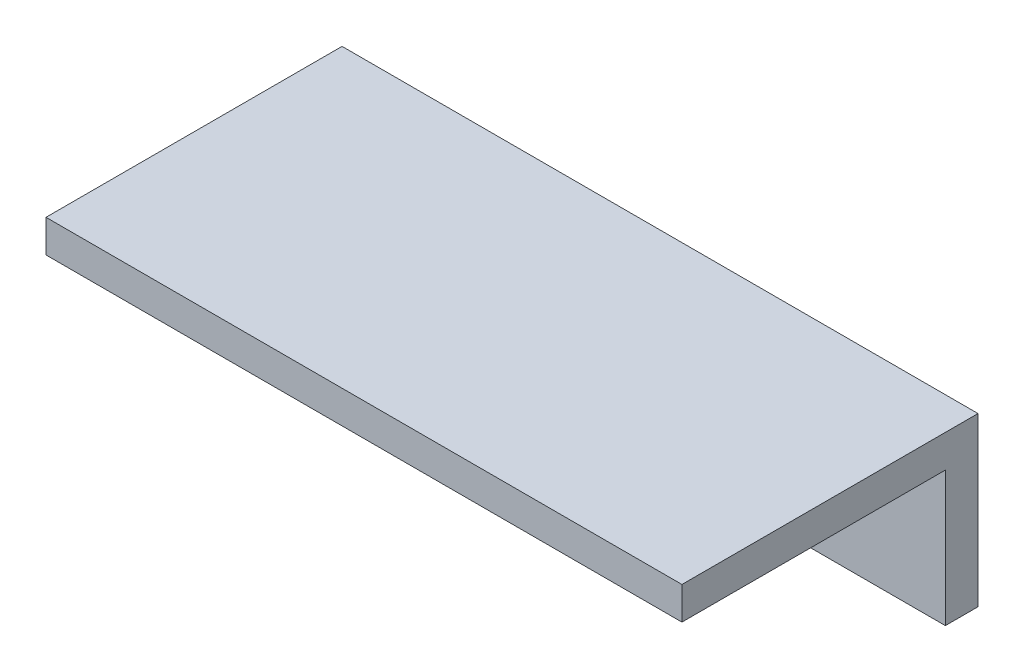
ISO-10303-21;
HEADER;
FILE_DESCRIPTION(('STEP AP214'),'2;1');
FILE_NAME('part.step','',(''),(''),'','','');
FILE_SCHEMA(('AUTOMOTIVE_DESIGN { 1 0 10303 214 1 1 1 1 }'));
ENDSEC;
DATA;
#1=APPLICATION_CONTEXT('core data for automotive mechanical design processes');
#2=APPLICATION_PROTOCOL_DEFINITION('international standard','automotive_design',2000,#1);
#3=PRODUCT_CONTEXT('',#1,'mechanical');
#4=PRODUCT('Part','Part','',(#3));
#5=PRODUCT_RELATED_PRODUCT_CATEGORY('part','',(#4));
#6=PRODUCT_DEFINITION_FORMATION('','',#4);
#7=PRODUCT_DEFINITION_CONTEXT('part definition',#1,'design');
#8=PRODUCT_DEFINITION('design','',#6,#7);
#9=PRODUCT_DEFINITION_SHAPE('','',#8);
#10=(LENGTH_UNIT() NAMED_UNIT(*) SI_UNIT(.MILLI.,.METRE.));
#11=(NAMED_UNIT(*) PLANE_ANGLE_UNIT() SI_UNIT($,.RADIAN.));
#12=(NAMED_UNIT(*) SI_UNIT($,.STERADIAN.) SOLID_ANGLE_UNIT());
#13=UNCERTAINTY_MEASURE_WITH_UNIT(LENGTH_MEASURE(1.E-05),#10,'distance_accuracy_value','');
#14=(GEOMETRIC_REPRESENTATION_CONTEXT(3) GLOBAL_UNCERTAINTY_ASSIGNED_CONTEXT((#13)) GLOBAL_UNIT_ASSIGNED_CONTEXT((#10,
#11,#12)) REPRESENTATION_CONTEXT('',''));
#15=CARTESIAN_POINT('',(0.,0.,0.));
#16=DIRECTION('',(0.,0.,1.));
#17=DIRECTION('',(1.,0.,0.));
#18=AXIS2_PLACEMENT_3D('',#15,#16,#17);
#19=CARTESIAN_POINT('',(-34.1,-8.975,3.5));
#20=DIRECTION('',(1.,0.,0.));
#21=DIRECTION('',(0.,0.,-1.));
#22=AXIS2_PLACEMENT_3D('',#19,#20,#21);
#23=PLANE('',#22);
#24=DIRECTION('',(0.,-1.,0.));
#25=VECTOR('',#24,1.);
#26=CARTESIAN_POINT('',(-34.1,-8.975,0.));
#27=LINE('',#26,#25);
#28=CARTESIAN_POINT('',(-34.1,8.975,0.));
#29=VERTEX_POINT('',#28);
#30=CARTESIAN_POINT('',(-34.1,-8.975,0.));
#31=VERTEX_POINT('',#30);
#32=EDGE_CURVE('E91',#29,#31,#27,.T.);
#33=ORIENTED_EDGE('',*,*,#32,.T.);
#34=DIRECTION('',(0.,0.,-1.));
#35=VECTOR('',#34,1.);
#36=CARTESIAN_POINT('',(-34.1,-8.975,3.5));
#37=LINE('',#36,#35);
#38=CARTESIAN_POINT('',(-34.1,-8.975,3.5));
#39=VERTEX_POINT('',#38);
#40=EDGE_CURVE('E11',#39,#31,#37,.T.);
#41=ORIENTED_EDGE('',*,*,#40,.F.);
#42=DIRECTION('',(0.,-1.,0.));
#43=VECTOR('',#42,1.);
#44=CARTESIAN_POINT('',(-34.1,-8.975,3.5));
#45=LINE('',#44,#43);
#46=CARTESIAN_POINT('',(-34.1,5.475,3.5));
#47=VERTEX_POINT('',#46);
#48=EDGE_CURVE('E84',#47,#39,#45,.T.);
#49=ORIENTED_EDGE('',*,*,#48,.F.);
#50=DIRECTION('',(0.,0.,-1.));
#51=VECTOR('',#50,1.);
#52=CARTESIAN_POINT('',(-34.1,5.475,31.75));
#53=LINE('',#52,#51);
#54=CARTESIAN_POINT('',(-34.1,5.475,31.75));
#55=VERTEX_POINT('',#54);
#56=EDGE_CURVE('E99',#55,#47,#53,.T.);
#57=ORIENTED_EDGE('',*,*,#56,.F.);
#58=DIRECTION('',(0.,-1.,0.));
#59=VECTOR('',#58,1.);
#60=CARTESIAN_POINT('',(-34.1,8.975,31.75));
#61=LINE('',#60,#59);
#62=CARTESIAN_POINT('',(-34.1,8.975,31.75));
#63=VERTEX_POINT('',#62);
#64=EDGE_CURVE('E94',#63,#55,#61,.T.);
#65=ORIENTED_EDGE('',*,*,#64,.F.);
#66=DIRECTION('',(0.,0.,-1.));
#67=VECTOR('',#66,1.);
#68=CARTESIAN_POINT('',(-34.1,8.975,3.5));
#69=LINE('',#68,#67);
#70=EDGE_CURVE('E77',#63,#29,#69,.T.);
#71=ORIENTED_EDGE('',*,*,#70,.T.);
#72=EDGE_LOOP('',(#33,#41,#49,#57,#65,#71));
#73=FACE_BOUND('',#72,.T.);
#74=ADVANCED_FACE('F33',(#73),#23,.F.);
#75=CARTESIAN_POINT('',(34.1,-8.975,3.5));
#76=DIRECTION('',(0.,1.,0.));
#77=DIRECTION('',(0.,0.,1.));
#78=AXIS2_PLACEMENT_3D('',#75,#76,#77);
#79=PLANE('',#78);
#80=DIRECTION('',(1.,0.,0.));
#81=VECTOR('',#80,1.);
#82=CARTESIAN_POINT('',(34.1,-8.975,0.));
#83=LINE('',#82,#81);
#84=CARTESIAN_POINT('',(34.1,-8.975,0.));
#85=VERTEX_POINT('',#84);
#86=EDGE_CURVE('E98',#31,#85,#83,.T.);
#87=ORIENTED_EDGE('',*,*,#86,.T.);
#88=DIRECTION('',(0.,0.,-1.));
#89=VECTOR('',#88,1.);
#90=CARTESIAN_POINT('',(34.1,-8.975,3.5));
#91=LINE('',#90,#89);
#92=CARTESIAN_POINT('',(34.1,-8.975,3.5));
#93=VERTEX_POINT('',#92);
#94=EDGE_CURVE('E40',#93,#85,#91,.T.);
#95=ORIENTED_EDGE('',*,*,#94,.F.);
#96=DIRECTION('',(1.,0.,0.));
#97=VECTOR('',#96,1.);
#98=CARTESIAN_POINT('',(34.1,-8.975,3.5));
#99=LINE('',#98,#97);
#100=EDGE_CURVE('E53',#39,#93,#99,.T.);
#101=ORIENTED_EDGE('',*,*,#100,.F.);
#102=ORIENTED_EDGE('',*,*,#40,.T.);
#103=EDGE_LOOP('',(#87,#95,#101,#102));
#104=FACE_BOUND('',#103,.T.);
#105=ADVANCED_FACE('F115',(#104),#79,.F.);
#106=CARTESIAN_POINT('',(34.1,-8.975,3.5));
#107=DIRECTION('',(-1.,0.,0.));
#108=DIRECTION('',(0.,0.,1.));
#109=AXIS2_PLACEMENT_3D('',#106,#107,#108);
#110=PLANE('',#109);
#111=DIRECTION('',(0.,1.,0.));
#112=VECTOR('',#111,1.);
#113=CARTESIAN_POINT('',(34.1,-8.975,0.));
#114=LINE('',#113,#112);
#115=CARTESIAN_POINT('',(34.1,8.975,0.));
#116=VERTEX_POINT('',#115);
#117=EDGE_CURVE('E85',#85,#116,#114,.T.);
#118=ORIENTED_EDGE('',*,*,#117,.T.);
#119=DIRECTION('',(0.,0.,-1.));
#120=VECTOR('',#119,1.);
#121=CARTESIAN_POINT('',(34.1,8.975,3.5));
#122=LINE('',#121,#120);
#123=CARTESIAN_POINT('',(34.1,8.975,31.75));
#124=VERTEX_POINT('',#123);
#125=EDGE_CURVE('E80',#124,#116,#122,.T.);
#126=ORIENTED_EDGE('',*,*,#125,.F.);
#127=DIRECTION('',(0.,1.,0.));
#128=VECTOR('',#127,1.);
#129=CARTESIAN_POINT('',(34.1,8.975,31.75));
#130=LINE('',#129,#128);
#131=CARTESIAN_POINT('',(34.1,5.475,31.75));
#132=VERTEX_POINT('',#131);
#133=EDGE_CURVE('E130',#132,#124,#130,.T.);
#134=ORIENTED_EDGE('',*,*,#133,.F.);
#135=DIRECTION('',(0.,0.,-1.));
#136=VECTOR('',#135,1.);
#137=CARTESIAN_POINT('',(34.1,5.475,31.75));
#138=LINE('',#137,#136);
#139=CARTESIAN_POINT('',(34.1,5.475,3.5));
#140=VERTEX_POINT('',#139);
#141=EDGE_CURVE('E103',#132,#140,#138,.T.);
#142=ORIENTED_EDGE('',*,*,#141,.T.);
#143=DIRECTION('',(0.,1.,0.));
#144=VECTOR('',#143,1.);
#145=CARTESIAN_POINT('',(34.1,-8.975,3.5));
#146=LINE('',#145,#144);
#147=EDGE_CURVE('E95',#93,#140,#146,.T.);
#148=ORIENTED_EDGE('',*,*,#147,.F.);
#149=ORIENTED_EDGE('',*,*,#94,.T.);
#150=EDGE_LOOP('',(#118,#126,#134,#142,#148,#149));
#151=FACE_BOUND('',#150,.T.);
#152=ADVANCED_FACE('F112',(#151),#110,.F.);
#153=CARTESIAN_POINT('',(34.1,8.975,3.5));
#154=DIRECTION('',(0.,-1.,0.));
#155=DIRECTION('',(0.,0.,-1.));
#156=AXIS2_PLACEMENT_3D('',#153,#154,#155);
#157=PLANE('',#156);
#158=DIRECTION('',(-1.,0.,0.));
#159=VECTOR('',#158,1.);
#160=CARTESIAN_POINT('',(34.1,8.975,0.));
#161=LINE('',#160,#159);
#162=EDGE_CURVE('E73',#116,#29,#161,.T.);
#163=ORIENTED_EDGE('',*,*,#162,.T.);
#164=ORIENTED_EDGE('',*,*,#70,.F.);
#165=DIRECTION('',(-1.,0.,0.));
#166=VECTOR('',#165,1.);
#167=CARTESIAN_POINT('',(-34.1,8.975,31.75));
#168=LINE('',#167,#166);
#169=EDGE_CURVE('E133',#124,#63,#168,.T.);
#170=ORIENTED_EDGE('',*,*,#169,.F.);
#171=ORIENTED_EDGE('',*,*,#125,.T.);
#172=EDGE_LOOP('',(#163,#164,#170,#171));
#173=FACE_BOUND('',#172,.T.);
#174=ADVANCED_FACE('F75',(#173),#157,.F.);
#175=CARTESIAN_POINT('',(0.,0.,3.5));
#176=DIRECTION('',(0.,0.,1.));
#177=DIRECTION('',(1.,0.,0.));
#178=AXIS2_PLACEMENT_3D('',#175,#176,#177);
#179=PLANE('',#178);
#180=CARTESIAN_POINT('',(0.,-3.07053348593506,3.5));
#181=DIRECTION('',(0.,0.,1.));
#182=DIRECTION('',(1.,0.,0.));
#183=AXIS2_PLACEMENT_3D('',#180,#181,#182);
#184=CIRCLE('',#183,2.85);
#185=CARTESIAN_POINT('',(2.85,-3.07053348593506,3.5));
#186=VERTEX_POINT('',#185);
#187=EDGE_CURVE('E135',#186,#186,#184,.T.);
#188=ORIENTED_EDGE('',*,*,#187,.F.);
#189=EDGE_LOOP('',(#188));
#190=FACE_BOUND('',#189,.T.);
#191=DIRECTION('',(1.,0.,0.));
#192=VECTOR('',#191,1.);
#193=CARTESIAN_POINT('',(-34.1,5.475,3.5));
#194=LINE('',#193,#192);
#195=EDGE_CURVE('E47',#47,#140,#194,.T.);
#196=ORIENTED_EDGE('',*,*,#195,.F.);
#197=ORIENTED_EDGE('',*,*,#48,.T.);
#198=ORIENTED_EDGE('',*,*,#100,.T.);
#199=ORIENTED_EDGE('',*,*,#147,.T.);
#200=EDGE_LOOP('',(#196,#197,#198,#199));
#201=FACE_BOUND('',#200,.T.);
#202=ADVANCED_FACE('F142',(#190,#201),#179,.T.);
#203=CARTESIAN_POINT('',(0.,0.,0.));
#204=DIRECTION('',(0.,0.,1.));
#205=DIRECTION('',(1.,0.,0.));
#206=AXIS2_PLACEMENT_3D('',#203,#204,#205);
#207=PLANE('',#206);
#208=CARTESIAN_POINT('',(0.,-3.07053348593506,0.));
#209=DIRECTION('',(0.,0.,-1.));
#210=DIRECTION('',(-1.,0.,0.));
#211=AXIS2_PLACEMENT_3D('',#208,#209,#210);
#212=CIRCLE('',#211,2.85);
#213=CARTESIAN_POINT('',(-2.85,-3.07053348593506,0.));
#214=VERTEX_POINT('',#213);
#215=EDGE_CURVE('E218',#214,#214,#212,.T.);
#216=ORIENTED_EDGE('',*,*,#215,.F.);
#217=EDGE_LOOP('',(#216));
#218=FACE_BOUND('',#217,.T.);
#219=ORIENTED_EDGE('',*,*,#32,.F.);
#220=ORIENTED_EDGE('',*,*,#162,.F.);
#221=ORIENTED_EDGE('',*,*,#117,.F.);
#222=ORIENTED_EDGE('',*,*,#86,.F.);
#223=EDGE_LOOP('',(#219,#220,#221,#222));
#224=FACE_BOUND('',#223,.T.);
#225=ADVANCED_FACE('F97',(#218,#224),#207,.F.);
#226=CARTESIAN_POINT('',(-34.1,5.475,31.75));
#227=DIRECTION('',(0.,1.,0.));
#228=DIRECTION('',(0.,0.,1.));
#229=AXIS2_PLACEMENT_3D('',#226,#227,#228);
#230=PLANE('',#229);
#231=ORIENTED_EDGE('',*,*,#195,.T.);
#232=ORIENTED_EDGE('',*,*,#141,.F.);
#233=DIRECTION('',(1.,0.,0.));
#234=VECTOR('',#233,1.);
#235=CARTESIAN_POINT('',(-34.1,5.475,31.75));
#236=LINE('',#235,#234);
#237=EDGE_CURVE('E124',#55,#132,#236,.T.);
#238=ORIENTED_EDGE('',*,*,#237,.F.);
#239=ORIENTED_EDGE('',*,*,#56,.T.);
#240=EDGE_LOOP('',(#231,#232,#238,#239));
#241=FACE_BOUND('',#240,.T.);
#242=ADVANCED_FACE('F120',(#241),#230,.F.);
#243=CARTESIAN_POINT('',(0.,0.,31.75));
#244=DIRECTION('',(0.,0.,1.));
#245=DIRECTION('',(1.,0.,0.));
#246=AXIS2_PLACEMENT_3D('',#243,#244,#245);
#247=PLANE('',#246);
#248=ORIENTED_EDGE('',*,*,#64,.T.);
#249=ORIENTED_EDGE('',*,*,#237,.T.);
#250=ORIENTED_EDGE('',*,*,#133,.T.);
#251=ORIENTED_EDGE('',*,*,#169,.T.);
#252=EDGE_LOOP('',(#248,#249,#250,#251));
#253=FACE_BOUND('',#252,.T.);
#254=ADVANCED_FACE('F132',(#253),#247,.T.);
#255=CARTESIAN_POINT('',(0.,-3.07053348593506,28.25));
#256=DIRECTION('',(0.,0.,-1.));
#257=DIRECTION('',(-1.,0.,0.));
#258=AXIS2_PLACEMENT_3D('',#255,#256,#257);
#259=CYLINDRICAL_SURFACE('',#258,2.85);
#260=ORIENTED_EDGE('',*,*,#187,.T.);
#261=EDGE_LOOP('',(#260));
#262=FACE_BOUND('',#261,.T.);
#263=ORIENTED_EDGE('',*,*,#215,.T.);
#264=EDGE_LOOP('',(#263));
#265=FACE_BOUND('',#264,.T.);
#266=ADVANCED_FACE('F189',(#262,#265),#259,.F.);
#267=CLOSED_SHELL('',(#74,#105,#152,#174,#202,#225,#242,#254,#266));
#268=MANIFOLD_SOLID_BREP('B2',#267);
#269=ADVANCED_BREP_SHAPE_REPRESENTATION('',(#18,#268),#14);
#270=SHAPE_DEFINITION_REPRESENTATION(#9,#269);
ENDSEC;
END-ISO-10303-21;
